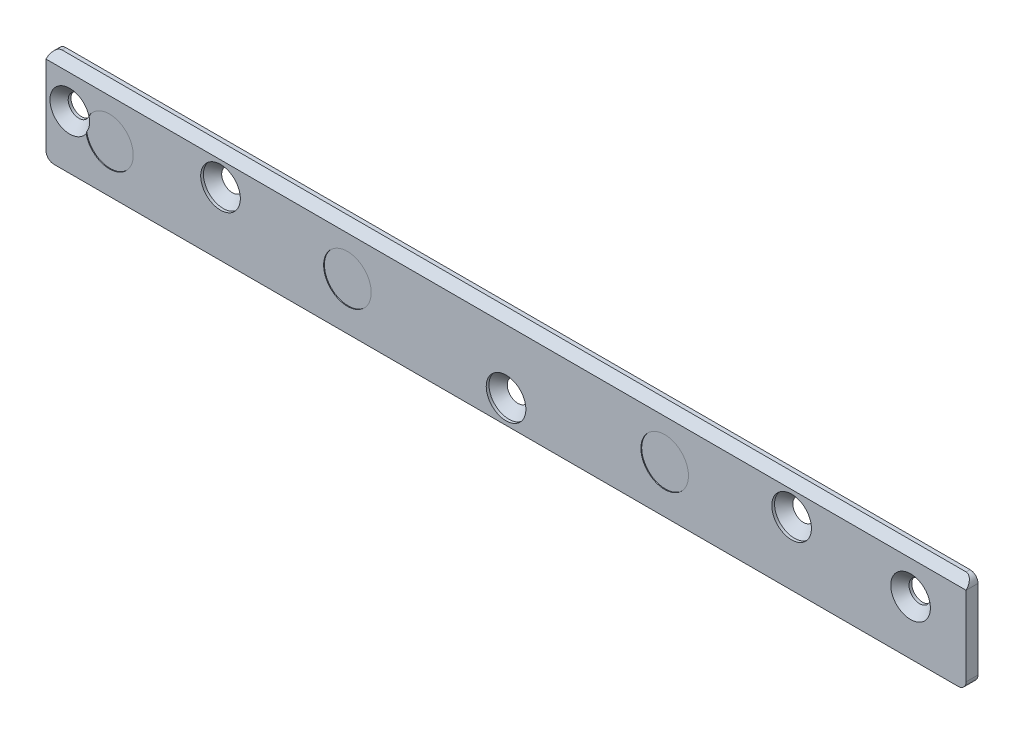
ISO-10303-21;
HEADER;
FILE_DESCRIPTION(('STEP AP214'),'2;1');
FILE_NAME('part.step','',(''),(''),'','','');
FILE_SCHEMA(('AUTOMOTIVE_DESIGN { 1 0 10303 214 1 1 1 1 }'));
ENDSEC;
DATA;
#1=APPLICATION_CONTEXT('core data for automotive mechanical design processes');
#2=APPLICATION_PROTOCOL_DEFINITION('international standard','automotive_design',2000,#1);
#3=PRODUCT_CONTEXT('',#1,'mechanical');
#4=PRODUCT('Part','Part','',(#3));
#5=PRODUCT_RELATED_PRODUCT_CATEGORY('part','',(#4));
#6=PRODUCT_DEFINITION_FORMATION('','',#4);
#7=PRODUCT_DEFINITION_CONTEXT('part definition',#1,'design');
#8=PRODUCT_DEFINITION('design','',#6,#7);
#9=PRODUCT_DEFINITION_SHAPE('','',#8);
#10=(LENGTH_UNIT() NAMED_UNIT(*) SI_UNIT(.MILLI.,.METRE.));
#11=(NAMED_UNIT(*) PLANE_ANGLE_UNIT() SI_UNIT($,.RADIAN.));
#12=(NAMED_UNIT(*) SI_UNIT($,.STERADIAN.) SOLID_ANGLE_UNIT());
#13=UNCERTAINTY_MEASURE_WITH_UNIT(LENGTH_MEASURE(1.E-05),#10,'distance_accuracy_value','');
#14=(GEOMETRIC_REPRESENTATION_CONTEXT(3) GLOBAL_UNCERTAINTY_ASSIGNED_CONTEXT((#13)) GLOBAL_UNIT_ASSIGNED_CONTEXT((#10,
#11,#12)) REPRESENTATION_CONTEXT('',''));
#15=CARTESIAN_POINT('',(0.,0.,0.));
#16=DIRECTION('',(0.,0.,1.));
#17=DIRECTION('',(1.,0.,0.));
#18=AXIS2_PLACEMENT_3D('',#15,#16,#17);
#19=CARTESIAN_POINT('',(-23.3000000000005,6.2661529514156,1.4));
#20=DIRECTION('',(0.,0.,-1.));
#21=DIRECTION('',(-1.,0.,0.));
#22=AXIS2_PLACEMENT_3D('',#19,#20,#21);
#23=PLANE('',#22);
#24=CARTESIAN_POINT('',(-20.0000000000005,3.,1.4));
#25=DIRECTION('',(0.,0.,-1.));
#26=DIRECTION('',(-1.,0.,0.));
#27=AXIS2_PLACEMENT_3D('',#24,#25,#26);
#28=CIRCLE('',#27,3.);
#29=CARTESIAN_POINT('',(-23.0000000000005,3.,1.4));
#30=VERTEX_POINT('',#29);
#31=EDGE_CURVE('E96',#30,#30,#28,.F.);
#32=ORIENTED_EDGE('',*,*,#31,.T.);
#33=EDGE_LOOP('',(#32));
#34=FACE_BOUND('',#33,.T.);
#35=ADVANCED_FACE('F16',(#34),#23,.F.);
#36=CARTESIAN_POINT('',(16.6999999999995,6.2661529514156,1.4));
#37=DIRECTION('',(0.,0.,-1.));
#38=DIRECTION('',(-1.,0.,0.));
#39=AXIS2_PLACEMENT_3D('',#36,#37,#38);
#40=PLANE('',#39);
#41=CARTESIAN_POINT('',(19.9999999999995,3.,1.4));
#42=DIRECTION('',(0.,0.,-1.));
#43=DIRECTION('',(-1.,0.,0.));
#44=AXIS2_PLACEMENT_3D('',#41,#42,#43);
#45=CIRCLE('',#44,3.00000000000001);
#46=CARTESIAN_POINT('',(16.9999999999995,3.,1.4));
#47=VERTEX_POINT('',#46);
#48=EDGE_CURVE('E125',#47,#47,#45,.F.);
#49=ORIENTED_EDGE('',*,*,#48,.T.);
#50=EDGE_LOOP('',(#49));
#51=FACE_BOUND('',#50,.T.);
#52=ADVANCED_FACE('F324',(#51),#40,.F.);
#53=CARTESIAN_POINT('',(-53.3000000000005,6.26615295141169,1.4));
#54=DIRECTION('',(0.,0.,-1.));
#55=DIRECTION('',(-1.,0.,0.));
#56=AXIS2_PLACEMENT_3D('',#53,#54,#55);
#57=PLANE('',#56);
#58=CARTESIAN_POINT('',(-54.9999999999998,3.79999999999997,1.40000000095597));
#59=DIRECTION('',(0.,0.,1.));
#60=DIRECTION('',(1.,0.,0.));
#61=AXIS2_PLACEMENT_3D('',#58,#59,#60);
#62=CIRCLE('',#61,2.39999999900004);
#63=CARTESIAN_POINT('',(-52.6687485510078,4.37032155769581,1.40000000026919));
#64=VERTEX_POINT('',#63);
#65=CARTESIAN_POINT('',(-52.9630767224714,2.53077048605737,1.40000000047799));
#66=VERTEX_POINT('',#65);
#67=EDGE_CURVE('E90',#64,#66,#62,.F.);
#68=ORIENTED_EDGE('',*,*,#67,.T.);
#69=CARTESIAN_POINT('',(-50.0000000000005,2.99999999999608,1.4));
#70=DIRECTION('',(0.,0.,-1.));
#71=DIRECTION('',(0.,1.,0.));
#72=AXIS2_PLACEMENT_3D('',#69,#70,#71);
#73=CIRCLE('',#72,3.);
#74=EDGE_CURVE('E19',#66,#64,#73,.F.);
#75=ORIENTED_EDGE('',*,*,#74,.T.);
#76=EDGE_LOOP('',(#68,#75));
#77=FACE_BOUND('',#76,.T.);
#78=ADVANCED_FACE('F93',(#77),#57,.F.);
#79=CARTESIAN_POINT('',(-50.0000000000005,2.99999999999608,1.5));
#80=DIRECTION('',(0.,0.,-1.));
#81=DIRECTION('',(0.,1.,0.));
#82=AXIS2_PLACEMENT_3D('',#79,#80,#81);
#83=CYLINDRICAL_SURFACE('',#82,3.);
#84=CARTESIAN_POINT('',(-52.6687485506591,4.37032155837476,1.4));
#85=CARTESIAN_POINT('',(-52.6660397951299,4.3755969484911,1.40388482773496));
#86=CARTESIAN_POINT('',(-52.6633208190581,4.38085375781325,1.40778774323929));
#87=CARTESIAN_POINT('',(-52.657834762917,4.39138419663782,1.41566863463607));
#88=CARTESIAN_POINT('',(-52.6550674752175,4.3966574489764,1.41964696999236));
#89=CARTESIAN_POINT('',(-52.6494843119855,4.40722028381948,1.42767869554667));
#90=CARTESIAN_POINT('',(-52.6466682283895,4.4125094886886,1.43173243768553));
#91=CARTESIAN_POINT('',(-52.640986988878,4.42310372663375,1.43991498771312));
#92=CARTESIAN_POINT('',(-52.6381216244665,4.42840838159551,1.44404414036043));
#93=CARTESIAN_POINT('',(-52.6323413406752,4.43903301042398,1.45237751737772));
#94=CARTESIAN_POINT('',(-52.6294262123922,4.44435260573252,1.45658207944288));
#95=CARTESIAN_POINT('',(-52.623545919399,4.45500659695527,1.46506628332172));
#96=CARTESIAN_POINT('',(-52.6205805453964,4.46034061388115,1.46934625595431));
#97=CARTESIAN_POINT('',(-52.6145992815252,4.47102292266564,1.47798128473303));
#98=CARTESIAN_POINT('',(-52.611583182001,4.47637083513154,1.4823366649431));
#99=CARTESIAN_POINT('',(-52.6054999877374,4.48708039671597,1.49112252682903));
#100=CARTESIAN_POINT('',(-52.6024326829854,4.49244166600766,1.49555332611441));
#101=CARTESIAN_POINT('',(-52.5993546368464,4.49778351970366,1.5));
#102=B_SPLINE_CURVE_WITH_KNOTS('',3,(#84,#85,#86,#87,#88,#89,#90,#91,#92,#93,#94,#95,#96,#97,
#98,#99,#100,#101),.UNSPECIFIED.,.F.,.F.,(4,2,2,2,2,2,2,2,4),(0.,0.0212680026238982,
0.0427533644119829,0.0644568317355751,0.0863791286888703,0.108520957897102,0.130883001291979,
0.153465920855824,0.176270359335619),.UNSPECIFIED.);
#103=CARTESIAN_POINT('',(-52.5993546372038,4.49778351908351,1.50000000030488));
#104=VERTEX_POINT('',#103);
#105=EDGE_CURVE('E98',#104,#64,#102,.F.);
#106=ORIENTED_EDGE('',*,*,#105,.T.);
#107=ORIENTED_EDGE('',*,*,#74,.F.);
#108=CARTESIAN_POINT('',(-52.9369168140119,2.3880199124301,1.5));
#109=CARTESIAN_POINT('',(-52.9381744729189,2.39405547893345,1.49555332611441));
#110=CARTESIAN_POINT('',(-52.9394158687623,2.40010614032041,1.49112252682904));
#111=CARTESIAN_POINT('',(-52.9418538609459,2.4121790917364,1.48233666494312));
#112=CARTESIAN_POINT('',(-52.943050775325,2.41820108642682,1.47798128473305));
#113=CARTESIAN_POINT('',(-52.9454004288986,2.43021634200249,1.46934625595433));
#114=CARTESIAN_POINT('',(-52.9465534856574,2.4362093078502,1.46506628332174));
#115=CARTESIAN_POINT('',(-52.9488160444536,2.44816615535925,1.4565820794429));
#116=CARTESIAN_POINT('',(-52.949925863584,2.45412974225394,1.45237751737775));
#117=CARTESIAN_POINT('',(-52.9521025672707,2.46602748907888,1.44404414036045));
#118=CARTESIAN_POINT('',(-52.9531697684162,2.47196135452977,1.43991498771315));
#119=CARTESIAN_POINT('',(-52.9552618546462,2.48379932459358,1.43173243768556));
#120=CARTESIAN_POINT('',(-52.9562870557946,2.4897031350218,1.42767869554669));
#121=CARTESIAN_POINT('',(-52.9582957600687,2.50148066866589,1.41964696999238));
#122=CARTESIAN_POINT('',(-52.9592795786978,2.50735409801704,1.41566863463608));
#123=CARTESIAN_POINT('',(-52.961206131623,2.51907055429223,1.4077877432393));
#124=CARTESIAN_POINT('',(-52.9621491808637,2.52491328766439,1.40388482773496));
#125=CARTESIAN_POINT('',(-52.963076722352,2.53077048530355,1.4));
#126=B_SPLINE_CURVE_WITH_KNOTS('',3,(#108,#109,#110,#111,#112,#113,#114,#115,#116,#117,#118,
#119,#120,#121,#122,#123,#124,#125),.UNSPECIFIED.,.F.,.F.,(4,2,2,2,2,2,2,2,4),(0.,
0.0228044384797787,0.0453873580436086,0.0677494014384817,0.0898912306467098,0.111813527600009,
0.133516994923611,0.155002356711711,0.176270359335627),.UNSPECIFIED.);
#127=CARTESIAN_POINT('',(-52.9369168141579,2.38801991313079,1.50000000030488));
#128=VERTEX_POINT('',#127);
#129=EDGE_CURVE('E106',#66,#128,#126,.F.);
#130=ORIENTED_EDGE('',*,*,#129,.T.);
#131=CARTESIAN_POINT('',(-50.0000000000005,2.99999999999608,1.5));
#132=DIRECTION('',(0.,0.,-1.));
#133=DIRECTION('',(0.,1.,0.));
#134=AXIS2_PLACEMENT_3D('',#131,#132,#133);
#135=CIRCLE('',#134,3.);
#136=EDGE_CURVE('E101',#104,#128,#135,.T.);
#137=ORIENTED_EDGE('',*,*,#136,.F.);
#138=EDGE_LOOP('',(#106,#107,#130,#137));
#139=FACE_BOUND('',#138,.T.);
#140=ADVANCED_FACE('F99',(#139),#83,.F.);
#141=CARTESIAN_POINT('',(-20.0000000000005,3.,1.5));
#142=DIRECTION('',(0.,0.,-1.));
#143=DIRECTION('',(-1.,0.,0.));
#144=AXIS2_PLACEMENT_3D('',#141,#142,#143);
#145=CYLINDRICAL_SURFACE('',#144,3.);
#146=CARTESIAN_POINT('',(-20.0000000000005,3.,1.5));
#147=DIRECTION('',(0.,0.,-1.));
#148=DIRECTION('',(-1.,0.,0.));
#149=AXIS2_PLACEMENT_3D('',#146,#147,#148);
#150=CIRCLE('',#149,3.);
#151=CARTESIAN_POINT('',(-23.0000000000005,3.,1.5));
#152=VERTEX_POINT('',#151);
#153=EDGE_CURVE('E263',#152,#152,#150,.T.);
#154=ORIENTED_EDGE('',*,*,#153,.F.);
#155=EDGE_LOOP('',(#154));
#156=FACE_BOUND('',#155,.T.);
#157=ORIENTED_EDGE('',*,*,#31,.F.);
#158=EDGE_LOOP('',(#157));
#159=FACE_BOUND('',#158,.T.);
#160=ADVANCED_FACE('F131',(#156,#159),#145,.F.);
#161=CARTESIAN_POINT('',(19.9999999999995,3.,1.5));
#162=DIRECTION('',(0.,0.,-1.));
#163=DIRECTION('',(-1.,0.,0.));
#164=AXIS2_PLACEMENT_3D('',#161,#162,#163);
#165=CYLINDRICAL_SURFACE('',#164,3.00000000000001);
#166=CARTESIAN_POINT('',(19.9999999999995,3.,1.5));
#167=DIRECTION('',(0.,0.,-1.));
#168=DIRECTION('',(-1.,0.,0.));
#169=AXIS2_PLACEMENT_3D('',#166,#167,#168);
#170=CIRCLE('',#169,3.00000000000001);
#171=CARTESIAN_POINT('',(16.9999999999995,3.,1.5));
#172=VERTEX_POINT('',#171);
#173=EDGE_CURVE('E260',#172,#172,#170,.T.);
#174=ORIENTED_EDGE('',*,*,#173,.F.);
#175=EDGE_LOOP('',(#174));
#176=FACE_BOUND('',#175,.T.);
#177=ORIENTED_EDGE('',*,*,#48,.F.);
#178=EDGE_LOOP('',(#177));
#179=FACE_BOUND('',#178,.T.);
#180=ADVANCED_FACE('F133',(#176,#179),#165,.F.);
#181=CARTESIAN_POINT('',(-57.,8.00000000000003,0.));
#182=DIRECTION('',(0.,0.,1.));
#183=DIRECTION('',(0.,-1.,0.));
#184=AXIS2_PLACEMENT_3D('',#181,#182,#183);
#185=CYLINDRICAL_SURFACE('',#184,0.999999999999975);
#186=CARTESIAN_POINT('',(-57.,8.00000000000003,0.));
#187=DIRECTION('',(0.,0.,1.));
#188=DIRECTION('',(0.,-1.,0.));
#189=AXIS2_PLACEMENT_3D('',#186,#187,#188);
#190=CIRCLE('',#189,0.999999999999975);
#191=CARTESIAN_POINT('',(-57.,9.,0.));
#192=VERTEX_POINT('',#191);
#193=CARTESIAN_POINT('',(-58.,8.00000000000001,0.));
#194=VERTEX_POINT('',#193);
#195=EDGE_CURVE('E120',#192,#194,#190,.T.);
#196=ORIENTED_EDGE('',*,*,#195,.T.);
#197=DIRECTION('',(0.,0.,1.));
#198=VECTOR('',#197,1.);
#199=CARTESIAN_POINT('',(-58.,8.,0.));
#200=LINE('',#199,#198);
#201=CARTESIAN_POINT('',(-58.,8.,1.5));
#202=VERTEX_POINT('',#201);
#203=EDGE_CURVE('E123',#194,#202,#200,.T.);
#204=ORIENTED_EDGE('',*,*,#203,.T.);
#205=CARTESIAN_POINT('',(-57.,8.00000000000003,1.49999999999997));
#206=DIRECTION('',(0.,0.707106781186547,0.707106781186548));
#207=DIRECTION('',(0.,-0.707106781186548,0.707106781186547));
#208=AXIS2_PLACEMENT_3D('',#205,#206,#207);
#209=ELLIPSE('',#208,1.41421356237306,0.999999999999975);
#210=CARTESIAN_POINT('',(-57.,9.00000000000001,0.499999999999998));
#211=VERTEX_POINT('',#210);
#212=EDGE_CURVE('E253',#211,#202,#209,.T.);
#213=ORIENTED_EDGE('',*,*,#212,.F.);
#214=DIRECTION('',(0.,0.,1.));
#215=VECTOR('',#214,1.);
#216=CARTESIAN_POINT('',(-57.,9.00000000000001,0.));
#217=LINE('',#216,#215);
#218=EDGE_CURVE('E124',#211,#192,#217,.F.);
#219=ORIENTED_EDGE('',*,*,#218,.T.);
#220=EDGE_LOOP('',(#196,#204,#213,#219));
#221=FACE_BOUND('',#220,.T.);
#222=ADVANCED_FACE('F141',(#221),#185,.T.);
#223=CARTESIAN_POINT('',(57.,8.00000000000001,0.));
#224=DIRECTION('',(0.,0.,1.));
#225=DIRECTION('',(1.,0.,0.));
#226=AXIS2_PLACEMENT_3D('',#223,#224,#225);
#227=CYLINDRICAL_SURFACE('',#226,0.999999999999993);
#228=CARTESIAN_POINT('',(57.,8.00000000000001,0.));
#229=DIRECTION('',(0.,0.,1.));
#230=DIRECTION('',(1.,0.,0.));
#231=AXIS2_PLACEMENT_3D('',#228,#229,#230);
#232=CIRCLE('',#231,0.999999999999993);
#233=CARTESIAN_POINT('',(58.,8.00000000000001,0.));
#234=VERTEX_POINT('',#233);
#235=CARTESIAN_POINT('',(57.,9.00000000000001,0.));
#236=VERTEX_POINT('',#235);
#237=EDGE_CURVE('E112',#234,#236,#232,.T.);
#238=ORIENTED_EDGE('',*,*,#237,.T.);
#239=DIRECTION('',(0.,0.,1.));
#240=VECTOR('',#239,1.);
#241=CARTESIAN_POINT('',(57.,9.00000000000001,0.));
#242=LINE('',#241,#240);
#243=CARTESIAN_POINT('',(57.,9.00000000000001,0.499999999999999));
#244=VERTEX_POINT('',#243);
#245=EDGE_CURVE('E109',#236,#244,#242,.T.);
#246=ORIENTED_EDGE('',*,*,#245,.T.);
#247=CARTESIAN_POINT('',(57.,8.00000000000001,1.49999999999999));
#248=DIRECTION('',(0.,0.707106781186547,0.707106781186548));
#249=DIRECTION('',(0.,-0.707106781186548,0.707106781186547));
#250=AXIS2_PLACEMENT_3D('',#247,#248,#249);
#251=ELLIPSE('',#250,1.41421356237308,0.999999999999993);
#252=CARTESIAN_POINT('',(58.,8.00000000000001,1.49999999999999));
#253=VERTEX_POINT('',#252);
#254=EDGE_CURVE('E244',#253,#244,#251,.T.);
#255=ORIENTED_EDGE('',*,*,#254,.F.);
#256=DIRECTION('',(0.,0.,1.));
#257=VECTOR('',#256,1.);
#258=CARTESIAN_POINT('',(58.,8.00000000000001,0.));
#259=LINE('',#258,#257);
#260=EDGE_CURVE('E119',#253,#234,#259,.F.);
#261=ORIENTED_EDGE('',*,*,#260,.T.);
#262=EDGE_LOOP('',(#238,#246,#255,#261));
#263=FACE_BOUND('',#262,.T.);
#264=ADVANCED_FACE('F223',(#263),#227,.T.);
#265=CARTESIAN_POINT('',(-54.9999999999998,3.79999999999997,1.5000000011014));
#266=DIRECTION('',(0.,0.,1.));
#267=DIRECTION('',(1.,0.,0.));
#268=AXIS2_PLACEMENT_3D('',#265,#266,#267);
#269=CONICAL_SURFACE('',#268,2.49999999896752,0.785398162507725);
#270=CARTESIAN_POINT('',(-54.9999999999998,3.79999999999997,0.349999999999997));
#271=DIRECTION('',(0.,0.,1.));
#272=DIRECTION('',(1.,0.,0.));
#273=AXIS2_PLACEMENT_3D('',#270,#271,#272);
#274=CIRCLE('',#273,1.35);
#275=CARTESIAN_POINT('',(-53.6499999999998,3.79999999999997,0.349999999999997));
#276=VERTEX_POINT('',#275);
#277=EDGE_CURVE('E248',#276,#276,#274,.F.);
#278=ORIENTED_EDGE('',*,*,#277,.T.);
#279=EDGE_LOOP('',(#278));
#280=FACE_BOUND('',#279,.T.);
#281=CARTESIAN_POINT('',(-54.9999999999998,3.79999999999997,1.5000000011014));
#282=DIRECTION('',(0.,0.,1.));
#283=DIRECTION('',(1.,0.,0.));
#284=AXIS2_PLACEMENT_3D('',#281,#282,#283);
#285=CIRCLE('',#284,2.49999999896752);
#286=EDGE_CURVE('E266',#128,#104,#285,.F.);
#287=ORIENTED_EDGE('',*,*,#286,.F.);
#288=ORIENTED_EDGE('',*,*,#129,.F.);
#289=ORIENTED_EDGE('',*,*,#67,.F.);
#290=ORIENTED_EDGE('',*,*,#105,.F.);
#291=EDGE_LOOP('',(#287,#288,#289,#290));
#292=FACE_BOUND('',#291,.T.);
#293=ADVANCED_FACE('F108',(#280,#292),#269,.F.);
#294=CARTESIAN_POINT('',(51.0000000000004,3.79999999999994,1.50000000002137));
#295=DIRECTION('',(0.,0.,1.));
#296=DIRECTION('',(0.,-1.,0.));
#297=AXIS2_PLACEMENT_3D('',#294,#295,#296);
#298=CONICAL_SURFACE('',#297,2.50000000004189,0.785398162483011);
#299=CARTESIAN_POINT('',(51.0000000000004,3.79999999999994,1.50000000002137));
#300=DIRECTION('',(0.,0.,1.));
#301=DIRECTION('',(0.,-1.,0.));
#302=AXIS2_PLACEMENT_3D('',#299,#300,#301);
#303=CIRCLE('',#302,2.50000000004189);
#304=CARTESIAN_POINT('',(51.0000000000004,1.29999999995805,1.50000000002137));
#305=VERTEX_POINT('',#304);
#306=EDGE_CURVE('E105',#305,#305,#303,.F.);
#307=ORIENTED_EDGE('',*,*,#306,.F.);
#308=EDGE_LOOP('',(#307));
#309=FACE_BOUND('',#308,.T.);
#310=CARTESIAN_POINT('',(51.0000000000004,3.79999999999994,0.35));
#311=DIRECTION('',(0.,0.,1.));
#312=DIRECTION('',(1.,0.,0.));
#313=AXIS2_PLACEMENT_3D('',#310,#311,#312);
#314=CIRCLE('',#313,1.35);
#315=CARTESIAN_POINT('',(52.3500000000004,3.79999999999994,0.35));
#316=VERTEX_POINT('',#315);
#317=EDGE_CURVE('E251',#316,#316,#314,.F.);
#318=ORIENTED_EDGE('',*,*,#317,.T.);
#319=EDGE_LOOP('',(#318));
#320=FACE_BOUND('',#319,.T.);
#321=ADVANCED_FACE('F216',(#309,#320),#298,.F.);
#322=CARTESIAN_POINT('',(0.,0.,1.5));
#323=DIRECTION('',(0.,0.,-1.));
#324=DIRECTION('',(-1.,0.,0.));
#325=AXIS2_PLACEMENT_3D('',#322,#323,#324);
#326=CYLINDRICAL_SURFACE('',#325,2.5);
#327=CARTESIAN_POINT('',(0.,0.,1.5));
#328=DIRECTION('',(0.,0.,-1.));
#329=DIRECTION('',(-1.,0.,0.));
#330=AXIS2_PLACEMENT_3D('',#327,#328,#329);
#331=CIRCLE('',#330,2.5);
#332=CARTESIAN_POINT('',(-2.5,0.,1.5));
#333=VERTEX_POINT('',#332);
#334=EDGE_CURVE('E274',#333,#333,#331,.T.);
#335=ORIENTED_EDGE('',*,*,#334,.F.);
#336=EDGE_LOOP('',(#335));
#337=FACE_BOUND('',#336,.T.);
#338=CARTESIAN_POINT('',(0.,0.,1.15000000107557));
#339=DIRECTION('',(0.,0.,1.));
#340=DIRECTION('',(1.,0.,0.));
#341=AXIS2_PLACEMENT_3D('',#338,#339,#340);
#342=CIRCLE('',#341,2.49999999903139);
#343=CARTESIAN_POINT('',(2.49999999903139,0.,1.15000000107557));
#344=VERTEX_POINT('',#343);
#345=EDGE_CURVE('E285',#344,#344,#342,.F.);
#346=ORIENTED_EDGE('',*,*,#345,.T.);
#347=EDGE_LOOP('',(#346));
#348=FACE_BOUND('',#347,.T.);
#349=ADVANCED_FACE('F212',(#337,#348),#326,.F.);
#350=CARTESIAN_POINT('',(35.9999999999991,4.99999999999946,1.5));
#351=DIRECTION('',(0.,0.,-1.));
#352=DIRECTION('',(0.,1.,0.));
#353=AXIS2_PLACEMENT_3D('',#350,#351,#352);
#354=CYLINDRICAL_SURFACE('',#353,2.50000000000001);
#355=CARTESIAN_POINT('',(35.9999999999991,4.99999999999946,1.5));
#356=DIRECTION('',(0.,0.,-1.));
#357=DIRECTION('',(0.,1.,0.));
#358=AXIS2_PLACEMENT_3D('',#355,#356,#357);
#359=CIRCLE('',#358,2.50000000000001);
#360=CARTESIAN_POINT('',(35.9999999999991,7.49999999999947,1.5));
#361=VERTEX_POINT('',#360);
#362=EDGE_CURVE('E272',#361,#361,#359,.T.);
#363=ORIENTED_EDGE('',*,*,#362,.F.);
#364=EDGE_LOOP('',(#363));
#365=FACE_BOUND('',#364,.T.);
#366=CARTESIAN_POINT('',(35.9999999999991,4.99999999999946,1.15000000101873));
#367=DIRECTION('',(0.,0.,1.));
#368=DIRECTION('',(1.,0.,0.));
#369=AXIS2_PLACEMENT_3D('',#366,#367,#368);
#370=CIRCLE('',#369,2.49999999897681);
#371=CARTESIAN_POINT('',(38.4999999989759,4.99999999999947,1.15000000101873));
#372=VERTEX_POINT('',#371);
#373=EDGE_CURVE('E288',#372,#372,#370,.F.);
#374=ORIENTED_EDGE('',*,*,#373,.T.);
#375=EDGE_LOOP('',(#374));
#376=FACE_BOUND('',#375,.T.);
#377=ADVANCED_FACE('F208',(#365,#376),#354,.F.);
#378=CARTESIAN_POINT('',(-36.0000000000009,4.99999999999956,1.5));
#379=DIRECTION('',(0.,0.,-1.));
#380=DIRECTION('',(0.,1.,0.));
#381=AXIS2_PLACEMENT_3D('',#378,#379,#380);
#382=CYLINDRICAL_SURFACE('',#381,2.49999999999999);
#383=CARTESIAN_POINT('',(-36.0000000000009,4.99999999999956,1.5));
#384=DIRECTION('',(0.,0.,-1.));
#385=DIRECTION('',(0.,1.,0.));
#386=AXIS2_PLACEMENT_3D('',#383,#384,#385);
#387=CIRCLE('',#386,2.49999999999999);
#388=CARTESIAN_POINT('',(-36.0000000000009,7.49999999999955,1.5));
#389=VERTEX_POINT('',#388);
#390=EDGE_CURVE('E269',#389,#389,#387,.T.);
#391=ORIENTED_EDGE('',*,*,#390,.F.);
#392=EDGE_LOOP('',(#391));
#393=FACE_BOUND('',#392,.T.);
#394=CARTESIAN_POINT('',(-36.0000000000009,4.99999999999955,1.15000000101873));
#395=DIRECTION('',(0.,0.,1.));
#396=DIRECTION('',(1.,0.,0.));
#397=AXIS2_PLACEMENT_3D('',#394,#395,#396);
#398=CIRCLE('',#397,2.49999999903093);
#399=CARTESIAN_POINT('',(-33.50000000097,4.99999999999955,1.15000000101873));
#400=VERTEX_POINT('',#399);
#401=EDGE_CURVE('E308',#400,#400,#398,.F.);
#402=ORIENTED_EDGE('',*,*,#401,.T.);
#403=EDGE_LOOP('',(#402));
#404=FACE_BOUND('',#403,.T.);
#405=ADVANCED_FACE('F204',(#393,#404),#382,.F.);
#406=CARTESIAN_POINT('',(-63.8,-3.60000000000001,1.5));
#407=DIRECTION('',(0.,0.,1.));
#408=DIRECTION('',(1.,0.,0.));
#409=AXIS2_PLACEMENT_3D('',#406,#407,#408);
#410=PLANE('',#409);
#411=CARTESIAN_POINT('',(57.,-1.99999999999999,1.5));
#412=DIRECTION('',(0.,0.,1.));
#413=DIRECTION('',(0.,-1.,0.));
#414=AXIS2_PLACEMENT_3D('',#411,#412,#413);
#415=CIRCLE('',#414,1.00000000000002);
#416=CARTESIAN_POINT('',(58.,-2.,1.5));
#417=VERTEX_POINT('',#416);
#418=CARTESIAN_POINT('',(57.,-3.,1.5));
#419=VERTEX_POINT('',#418);
#420=EDGE_CURVE('E257',#417,#419,#415,.F.);
#421=ORIENTED_EDGE('',*,*,#420,.F.);
#422=DIRECTION('',(0.,1.,0.));
#423=VECTOR('',#422,1.);
#424=CARTESIAN_POINT('',(58.,-2.00000001316422,1.5));
#425=LINE('',#424,#423);
#426=EDGE_CURVE('E306',#253,#417,#425,.F.);
#427=ORIENTED_EDGE('',*,*,#426,.F.);
#428=DIRECTION('',(1.,0.,0.));
#429=VECTOR('',#428,1.);
#430=CARTESIAN_POINT('',(-58.,8.,1.5));
#431=LINE('',#430,#429);
#432=EDGE_CURVE('E247',#202,#253,#431,.T.);
#433=ORIENTED_EDGE('',*,*,#432,.F.);
#434=DIRECTION('',(0.,1.,0.));
#435=VECTOR('',#434,1.);
#436=CARTESIAN_POINT('',(-58.,8.0000000131642,1.5));
#437=LINE('',#436,#435);
#438=CARTESIAN_POINT('',(-58.,-2.00000000427461,1.5));
#439=VERTEX_POINT('',#438);
#440=EDGE_CURVE('E299',#439,#202,#437,.T.);
#441=ORIENTED_EDGE('',*,*,#440,.F.);
#442=CARTESIAN_POINT('',(-57.,-1.99999999999998,1.5));
#443=DIRECTION('',(0.,0.,1.));
#444=DIRECTION('',(1.,0.,0.));
#445=AXIS2_PLACEMENT_3D('',#442,#443,#444);
#446=CIRCLE('',#445,1.00000000000003);
#447=CARTESIAN_POINT('',(-57.,-3.,1.5));
#448=VERTEX_POINT('',#447);
#449=EDGE_CURVE('E584',#448,#439,#446,.F.);
#450=ORIENTED_EDGE('',*,*,#449,.F.);
#451=DIRECTION('',(1.,0.,0.));
#452=VECTOR('',#451,1.);
#453=CARTESIAN_POINT('',(-57.,-2.99999999999999,1.5));
#454=LINE('',#453,#452);
#455=EDGE_CURVE('E302',#419,#448,#454,.F.);
#456=ORIENTED_EDGE('',*,*,#455,.F.);
#457=EDGE_LOOP('',(#421,#427,#433,#441,#450,#456));
#458=FACE_BOUND('',#457,.T.);
#459=ORIENTED_EDGE('',*,*,#173,.T.);
#460=EDGE_LOOP('',(#459));
#461=FACE_BOUND('',#460,.T.);
#462=ORIENTED_EDGE('',*,*,#153,.T.);
#463=EDGE_LOOP('',(#462));
#464=FACE_BOUND('',#463,.T.);
#465=ORIENTED_EDGE('',*,*,#136,.T.);
#466=ORIENTED_EDGE('',*,*,#286,.T.);
#467=EDGE_LOOP('',(#465,#466));
#468=FACE_BOUND('',#467,.T.);
#469=ORIENTED_EDGE('',*,*,#390,.T.);
#470=EDGE_LOOP('',(#469));
#471=FACE_BOUND('',#470,.T.);
#472=ORIENTED_EDGE('',*,*,#362,.T.);
#473=EDGE_LOOP('',(#472));
#474=FACE_BOUND('',#473,.T.);
#475=ORIENTED_EDGE('',*,*,#334,.T.);
#476=EDGE_LOOP('',(#475));
#477=FACE_BOUND('',#476,.T.);
#478=ORIENTED_EDGE('',*,*,#306,.T.);
#479=EDGE_LOOP('',(#478));
#480=FACE_BOUND('',#479,.T.);
#481=ADVANCED_FACE('F200',(#458,#461,#464,#468,#471,#474,#477,#480),#410,.T.);
#482=CARTESIAN_POINT('',(-58.,8.,1.5));
#483=DIRECTION('',(0.,0.707106781186547,0.707106781186548));
#484=DIRECTION('',(0.,-0.707106781186548,0.707106781186547));
#485=AXIS2_PLACEMENT_3D('',#482,#483,#484);
#486=PLANE('',#485);
#487=ORIENTED_EDGE('',*,*,#254,.T.);
#488=DIRECTION('',(-1.,0.,0.));
#489=VECTOR('',#488,1.);
#490=CARTESIAN_POINT('',(62.985,9.,0.5));
#491=LINE('',#490,#489);
#492=EDGE_CURVE('E240',#211,#244,#491,.F.);
#493=ORIENTED_EDGE('',*,*,#492,.F.);
#494=ORIENTED_EDGE('',*,*,#212,.T.);
#495=ORIENTED_EDGE('',*,*,#432,.T.);
#496=EDGE_LOOP('',(#487,#493,#494,#495));
#497=FACE_BOUND('',#496,.T.);
#498=ADVANCED_FACE('F196',(#497),#486,.T.);
#499=CARTESIAN_POINT('',(-54.9999999999998,3.79999999999997,-2.49999999999999));
#500=DIRECTION('',(0.,0.,1.));
#501=DIRECTION('',(1.,0.,0.));
#502=AXIS2_PLACEMENT_3D('',#499,#500,#501);
#503=CYLINDRICAL_SURFACE('',#502,1.35);
#504=CARTESIAN_POINT('',(-54.9999999999998,3.79999999999997,0.));
#505=DIRECTION('',(0.,0.,1.));
#506=DIRECTION('',(1.,0.,0.));
#507=AXIS2_PLACEMENT_3D('',#504,#505,#506);
#508=CIRCLE('',#507,1.35);
#509=CARTESIAN_POINT('',(-53.6499999999998,3.79999999999997,0.));
#510=VERTEX_POINT('',#509);
#511=EDGE_CURVE('E298',#510,#510,#508,.T.);
#512=ORIENTED_EDGE('',*,*,#511,.F.);
#513=EDGE_LOOP('',(#512));
#514=FACE_BOUND('',#513,.T.);
#515=ORIENTED_EDGE('',*,*,#277,.F.);
#516=EDGE_LOOP('',(#515));
#517=FACE_BOUND('',#516,.T.);
#518=ADVANCED_FACE('F192',(#514,#517),#503,.F.);
#519=CARTESIAN_POINT('',(51.0000000000004,3.79999999999994,-2.49999999999999));
#520=DIRECTION('',(0.,0.,1.));
#521=DIRECTION('',(1.,0.,0.));
#522=AXIS2_PLACEMENT_3D('',#519,#520,#521);
#523=CYLINDRICAL_SURFACE('',#522,1.35);
#524=CARTESIAN_POINT('',(51.0000000000004,3.79999999999994,0.));
#525=DIRECTION('',(0.,0.,1.));
#526=DIRECTION('',(1.,0.,0.));
#527=AXIS2_PLACEMENT_3D('',#524,#525,#526);
#528=CIRCLE('',#527,1.35);
#529=CARTESIAN_POINT('',(52.3500000000004,3.79999999999994,0.));
#530=VERTEX_POINT('',#529);
#531=EDGE_CURVE('E580',#530,#530,#528,.T.);
#532=ORIENTED_EDGE('',*,*,#531,.F.);
#533=EDGE_LOOP('',(#532));
#534=FACE_BOUND('',#533,.T.);
#535=ORIENTED_EDGE('',*,*,#317,.F.);
#536=EDGE_LOOP('',(#535));
#537=FACE_BOUND('',#536,.T.);
#538=ADVANCED_FACE('F188',(#534,#537),#523,.F.);
#539=CARTESIAN_POINT('',(0.,0.,1.15000000096188));
#540=DIRECTION('',(0.,0.,1.));
#541=DIRECTION('',(0.,-1.,0.));
#542=AXIS2_PLACEMENT_3D('',#539,#540,#541);
#543=CONICAL_SURFACE('',#542,2.4999999989177,0.785398162507725);
#544=ORIENTED_EDGE('',*,*,#345,.F.);
#545=EDGE_LOOP('',(#544));
#546=FACE_BOUND('',#545,.T.);
#547=CARTESIAN_POINT('',(0.,0.,-5.6843418860808E-11));
#548=DIRECTION('',(0.,0.,1.));
#549=DIRECTION('',(0.,-1.,0.));
#550=AXIS2_PLACEMENT_3D('',#547,#548,#549);
#551=CIRCLE('',#550,1.34999999994534);
#552=CARTESIAN_POINT('',(0.,-1.34999999994534,-5.68434774077254E-11));
#553=VERTEX_POINT('',#552);
#554=EDGE_CURVE('E577',#553,#553,#551,.T.);
#555=ORIENTED_EDGE('',*,*,#554,.F.);
#556=EDGE_LOOP('',(#555));
#557=FACE_BOUND('',#556,.T.);
#558=ADVANCED_FACE('F184',(#546,#557),#543,.F.);
#559=CARTESIAN_POINT('',(35.9999999999991,4.99999999999946,1.15000000096188));
#560=DIRECTION('',(0.,0.,1.));
#561=DIRECTION('',(1.,0.,0.));
#562=AXIS2_PLACEMENT_3D('',#559,#560,#561);
#563=CONICAL_SURFACE('',#562,2.49999999891997,0.785398162507725);
#564=ORIENTED_EDGE('',*,*,#373,.F.);
#565=EDGE_LOOP('',(#564));
#566=FACE_BOUND('',#565,.T.);
#567=CARTESIAN_POINT('',(35.9999999999991,4.99999999999946,0.));
#568=DIRECTION('',(0.,0.,1.));
#569=DIRECTION('',(1.,0.,0.));
#570=AXIS2_PLACEMENT_3D('',#567,#568,#569);
#571=CIRCLE('',#570,1.35000000000445);
#572=CARTESIAN_POINT('',(37.3500000000035,4.99999999999946,0.));
#573=VERTEX_POINT('',#572);
#574=EDGE_CURVE('E574',#573,#573,#571,.T.);
#575=ORIENTED_EDGE('',*,*,#574,.F.);
#576=EDGE_LOOP('',(#575));
#577=FACE_BOUND('',#576,.T.);
#578=ADVANCED_FACE('F180',(#566,#577),#563,.F.);
#579=CARTESIAN_POINT('',(-36.0000000000009,4.99999999999955,1.15000000096188));
#580=DIRECTION('',(0.,0.,1.));
#581=DIRECTION('',(1.,0.,0.));
#582=AXIS2_PLACEMENT_3D('',#579,#580,#581);
#583=CONICAL_SURFACE('',#582,2.49999999891724,0.785398162507725);
#584=ORIENTED_EDGE('',*,*,#401,.F.);
#585=EDGE_LOOP('',(#584));
#586=FACE_BOUND('',#585,.T.);
#587=CARTESIAN_POINT('',(-36.0000000000009,4.99999999999955,0.));
#588=DIRECTION('',(0.,0.,1.));
#589=DIRECTION('',(1.,0.,0.));
#590=AXIS2_PLACEMENT_3D('',#587,#588,#589);
#591=CIRCLE('',#590,1.35000000000172);
#592=CARTESIAN_POINT('',(-34.6499999999992,4.99999999999955,0.));
#593=VERTEX_POINT('',#592);
#594=EDGE_CURVE('E571',#593,#593,#591,.T.);
#595=ORIENTED_EDGE('',*,*,#594,.F.);
#596=EDGE_LOOP('',(#595));
#597=FACE_BOUND('',#596,.T.);
#598=ADVANCED_FACE('F176',(#586,#597),#583,.F.);
#599=CARTESIAN_POINT('',(58.,-2.00000001316422,0.));
#600=DIRECTION('',(1.,0.,0.));
#601=DIRECTION('',(0.,0.,-1.));
#602=AXIS2_PLACEMENT_3D('',#599,#600,#601);
#603=PLANE('',#602);
#604=ORIENTED_EDGE('',*,*,#426,.T.);
#605=DIRECTION('',(0.,0.,1.));
#606=VECTOR('',#605,1.);
#607=CARTESIAN_POINT('',(58.,-2.00000000000001,0.));
#608=LINE('',#607,#606);
#609=CARTESIAN_POINT('',(58.,-2.,0.));
#610=VERTEX_POINT('',#609);
#611=EDGE_CURVE('E307',#610,#417,#608,.T.);
#612=ORIENTED_EDGE('',*,*,#611,.F.);
#613=DIRECTION('',(0.,1.,0.));
#614=VECTOR('',#613,1.);
#615=CARTESIAN_POINT('',(58.,9.60000000000001,0.));
#616=LINE('',#615,#614);
#617=EDGE_CURVE('E570',#234,#610,#616,.F.);
#618=ORIENTED_EDGE('',*,*,#617,.F.);
#619=ORIENTED_EDGE('',*,*,#260,.F.);
#620=EDGE_LOOP('',(#604,#612,#618,#619));
#621=FACE_BOUND('',#620,.T.);
#622=ADVANCED_FACE('F172',(#621),#603,.T.);
#623=CARTESIAN_POINT('',(57.,-1.99999999999999,0.));
#624=DIRECTION('',(0.,0.,1.));
#625=DIRECTION('',(0.,-1.,0.));
#626=AXIS2_PLACEMENT_3D('',#623,#624,#625);
#627=CYLINDRICAL_SURFACE('',#626,1.00000000000002);
#628=ORIENTED_EDGE('',*,*,#420,.T.);
#629=DIRECTION('',(0.,0.,1.));
#630=VECTOR('',#629,1.);
#631=CARTESIAN_POINT('',(57.,-3.,0.));
#632=LINE('',#631,#630);
#633=CARTESIAN_POINT('',(57.,-3.00000000000001,0.));
#634=VERTEX_POINT('',#633);
#635=EDGE_CURVE('E305',#634,#419,#632,.T.);
#636=ORIENTED_EDGE('',*,*,#635,.F.);
#637=CARTESIAN_POINT('',(57.,-1.99999999999999,0.));
#638=DIRECTION('',(0.,0.,1.));
#639=DIRECTION('',(0.,-1.,0.));
#640=AXIS2_PLACEMENT_3D('',#637,#638,#639);
#641=CIRCLE('',#640,1.00000000000002);
#642=EDGE_CURVE('E567',#610,#634,#641,.F.);
#643=ORIENTED_EDGE('',*,*,#642,.F.);
#644=ORIENTED_EDGE('',*,*,#611,.T.);
#645=EDGE_LOOP('',(#628,#636,#643,#644));
#646=FACE_BOUND('',#645,.T.);
#647=ADVANCED_FACE('F168',(#646),#627,.T.);
#648=CARTESIAN_POINT('',(-57.,-2.99999999999999,0.));
#649=DIRECTION('',(0.,-1.,0.));
#650=DIRECTION('',(1.,0.,0.));
#651=AXIS2_PLACEMENT_3D('',#648,#649,#650);
#652=PLANE('',#651);
#653=ORIENTED_EDGE('',*,*,#455,.T.);
#654=DIRECTION('',(0.,0.,1.));
#655=VECTOR('',#654,1.);
#656=CARTESIAN_POINT('',(-57.,-3.00000000000001,0.));
#657=LINE('',#656,#655);
#658=CARTESIAN_POINT('',(-57.,-3.00000000000001,0.));
#659=VERTEX_POINT('',#658);
#660=EDGE_CURVE('E304',#659,#448,#657,.T.);
#661=ORIENTED_EDGE('',*,*,#660,.F.);
#662=DIRECTION('',(-1.,0.,0.));
#663=VECTOR('',#662,1.);
#664=CARTESIAN_POINT('',(-63.8,-3.00000000000001,0.));
#665=LINE('',#664,#663);
#666=EDGE_CURVE('E566',#634,#659,#665,.T.);
#667=ORIENTED_EDGE('',*,*,#666,.F.);
#668=ORIENTED_EDGE('',*,*,#635,.T.);
#669=EDGE_LOOP('',(#653,#661,#667,#668));
#670=FACE_BOUND('',#669,.T.);
#671=ADVANCED_FACE('F165',(#670),#652,.T.);
#672=CARTESIAN_POINT('',(-57.,-1.99999999999998,0.));
#673=DIRECTION('',(0.,0.,1.));
#674=DIRECTION('',(1.,0.,0.));
#675=AXIS2_PLACEMENT_3D('',#672,#673,#674);
#676=CYLINDRICAL_SURFACE('',#675,1.00000000000003);
#677=ORIENTED_EDGE('',*,*,#449,.T.);
#678=DIRECTION('',(0.,0.,1.));
#679=VECTOR('',#678,1.);
#680=CARTESIAN_POINT('',(-58.,-2.00000000854924,0.));
#681=LINE('',#680,#679);
#682=CARTESIAN_POINT('',(-58.,-2.00000000427461,0.));
#683=VERTEX_POINT('',#682);
#684=EDGE_CURVE('E34',#683,#439,#681,.T.);
#685=ORIENTED_EDGE('',*,*,#684,.F.);
#686=CARTESIAN_POINT('',(-57.,-1.99999999999998,0.));
#687=DIRECTION('',(0.,0.,1.));
#688=DIRECTION('',(1.,0.,0.));
#689=AXIS2_PLACEMENT_3D('',#686,#687,#688);
#690=CIRCLE('',#689,1.00000000000003);
#691=EDGE_CURVE('E559',#659,#683,#690,.F.);
#692=ORIENTED_EDGE('',*,*,#691,.F.);
#693=ORIENTED_EDGE('',*,*,#660,.T.);
#694=EDGE_LOOP('',(#677,#685,#692,#693));
#695=FACE_BOUND('',#694,.T.);
#696=ADVANCED_FACE('F161',(#695),#676,.T.);
#697=CARTESIAN_POINT('',(-58.,8.0000000131642,0.));
#698=DIRECTION('',(-1.,0.,0.));
#699=DIRECTION('',(0.,0.,1.));
#700=AXIS2_PLACEMENT_3D('',#697,#698,#699);
#701=PLANE('',#700);
#702=ORIENTED_EDGE('',*,*,#440,.T.);
#703=ORIENTED_EDGE('',*,*,#203,.F.);
#704=DIRECTION('',(0.,1.,0.));
#705=VECTOR('',#704,1.);
#706=CARTESIAN_POINT('',(-58.,9.60000000000001,0.));
#707=LINE('',#706,#705);
#708=EDGE_CURVE('E25',#683,#194,#707,.T.);
#709=ORIENTED_EDGE('',*,*,#708,.F.);
#710=ORIENTED_EDGE('',*,*,#684,.T.);
#711=EDGE_LOOP('',(#702,#703,#709,#710));
#712=FACE_BOUND('',#711,.T.);
#713=ADVANCED_FACE('F154',(#712),#701,.T.);
#714=CARTESIAN_POINT('',(62.985,9.,0.));
#715=DIRECTION('',(0.,1.,0.));
#716=DIRECTION('',(-1.,0.,0.));
#717=AXIS2_PLACEMENT_3D('',#714,#715,#716);
#718=PLANE('',#717);
#719=DIRECTION('',(-1.,0.,0.));
#720=VECTOR('',#719,1.);
#721=CARTESIAN_POINT('',(-63.8,9.,0.));
#722=LINE('',#721,#720);
#723=EDGE_CURVE('E11',#192,#236,#722,.F.);
#724=ORIENTED_EDGE('',*,*,#723,.F.);
#725=ORIENTED_EDGE('',*,*,#218,.F.);
#726=ORIENTED_EDGE('',*,*,#492,.T.);
#727=ORIENTED_EDGE('',*,*,#245,.F.);
#728=EDGE_LOOP('',(#724,#725,#726,#727));
#729=FACE_BOUND('',#728,.T.);
#730=ADVANCED_FACE('F148',(#729),#718,.T.);
#731=CARTESIAN_POINT('',(-63.8,9.60000000000001,0.));
#732=DIRECTION('',(0.,0.,-1.));
#733=DIRECTION('',(-1.,0.,0.));
#734=AXIS2_PLACEMENT_3D('',#731,#732,#733);
#735=PLANE('',#734);
#736=ORIENTED_EDGE('',*,*,#195,.F.);
#737=ORIENTED_EDGE('',*,*,#723,.T.);
#738=ORIENTED_EDGE('',*,*,#237,.F.);
#739=ORIENTED_EDGE('',*,*,#617,.T.);
#740=ORIENTED_EDGE('',*,*,#642,.T.);
#741=ORIENTED_EDGE('',*,*,#666,.T.);
#742=ORIENTED_EDGE('',*,*,#691,.T.);
#743=ORIENTED_EDGE('',*,*,#708,.T.);
#744=EDGE_LOOP('',(#736,#737,#738,#739,#740,#741,#742,#743));
#745=FACE_BOUND('',#744,.T.);
#746=ORIENTED_EDGE('',*,*,#594,.T.);
#747=EDGE_LOOP('',(#746));
#748=FACE_BOUND('',#747,.T.);
#749=ORIENTED_EDGE('',*,*,#574,.T.);
#750=EDGE_LOOP('',(#749));
#751=FACE_BOUND('',#750,.T.);
#752=ORIENTED_EDGE('',*,*,#554,.T.);
#753=EDGE_LOOP('',(#752));
#754=FACE_BOUND('',#753,.T.);
#755=ORIENTED_EDGE('',*,*,#531,.T.);
#756=EDGE_LOOP('',(#755));
#757=FACE_BOUND('',#756,.T.);
#758=ORIENTED_EDGE('',*,*,#511,.T.);
#759=EDGE_LOOP('',(#758));
#760=FACE_BOUND('',#759,.T.);
#761=ADVANCED_FACE('F146',(#745,#748,#751,#754,#757,#760),#735,.T.);
#762=CLOSED_SHELL('',(#35,#52,#78,#140,#160,#180,#222,#264,#293,#321,#349,#377,#405,#481,#498,
#518,#538,#558,#578,#598,#622,#647,#671,#696,#713,#730,#761));
#763=MANIFOLD_SOLID_BREP('B1',#762);
#764=ADVANCED_BREP_SHAPE_REPRESENTATION('',(#18,#763),#14);
#765=SHAPE_DEFINITION_REPRESENTATION(#9,#764);
ENDSEC;
END-ISO-10303-21;
